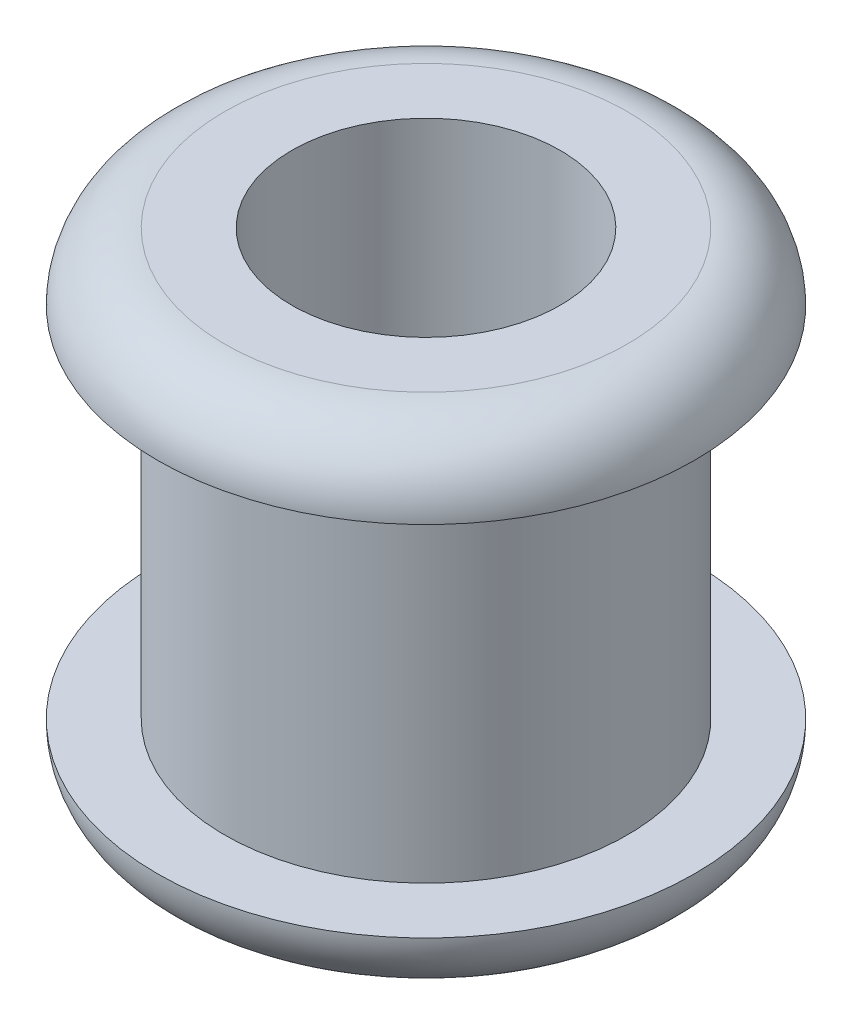
ISO-10303-21;
HEADER;
FILE_DESCRIPTION(('STEP AP214'),'2;1');
FILE_NAME('part.step','',(''),(''),'','','');
FILE_SCHEMA(('AUTOMOTIVE_DESIGN { 1 0 10303 214 1 1 1 1 }'));
ENDSEC;
DATA;
#1=APPLICATION_CONTEXT('core data for automotive mechanical design processes');
#2=APPLICATION_PROTOCOL_DEFINITION('international standard','automotive_design',2000,#1);
#3=PRODUCT_CONTEXT('',#1,'mechanical');
#4=PRODUCT('Part','Part','',(#3));
#5=PRODUCT_RELATED_PRODUCT_CATEGORY('part','',(#4));
#6=PRODUCT_DEFINITION_FORMATION('','',#4);
#7=PRODUCT_DEFINITION_CONTEXT('part definition',#1,'design');
#8=PRODUCT_DEFINITION('design','',#6,#7);
#9=PRODUCT_DEFINITION_SHAPE('','',#8);
#10=(LENGTH_UNIT() NAMED_UNIT(*) SI_UNIT(.MILLI.,.METRE.));
#11=(NAMED_UNIT(*) PLANE_ANGLE_UNIT() SI_UNIT($,.RADIAN.));
#12=(NAMED_UNIT(*) SI_UNIT($,.STERADIAN.) SOLID_ANGLE_UNIT());
#13=UNCERTAINTY_MEASURE_WITH_UNIT(LENGTH_MEASURE(1.E-05),#10,'distance_accuracy_value','');
#14=(GEOMETRIC_REPRESENTATION_CONTEXT(3) GLOBAL_UNCERTAINTY_ASSIGNED_CONTEXT((#13)) GLOBAL_UNIT_ASSIGNED_CONTEXT((#10,
#11,#12)) REPRESENTATION_CONTEXT('',''));
#15=CARTESIAN_POINT('',(0.,0.,0.));
#16=DIRECTION('',(0.,0.,1.));
#17=DIRECTION('',(1.,0.,0.));
#18=AXIS2_PLACEMENT_3D('',#15,#16,#17);
#19=CARTESIAN_POINT('',(4.7625,0.,0.));
#20=DIRECTION('',(0.,-1.,0.));
#21=DIRECTION('',(1.,0.,0.));
#22=AXIS2_PLACEMENT_3D('',#19,#20,#21);
#23=PLANE('',#22);
#24=CARTESIAN_POINT('',(0.,0.,0.));
#25=DIRECTION('',(0.,1.,0.));
#26=DIRECTION('',(-1.,0.,0.));
#27=AXIS2_PLACEMENT_3D('',#24,#25,#26);
#28=CIRCLE('',#27,4.7625);
#29=CARTESIAN_POINT('',(-4.7625,0.,0.));
#30=VERTEX_POINT('',#29);
#31=EDGE_CURVE('E10',#30,#30,#28,.T.);
#32=ORIENTED_EDGE('',*,*,#31,.F.);
#33=EDGE_LOOP('',(#32));
#34=FACE_BOUND('',#33,.T.);
#35=CARTESIAN_POINT('',(0.,0.,0.));
#36=DIRECTION('',(0.,1.,0.));
#37=DIRECTION('',(-1.,0.,0.));
#38=AXIS2_PLACEMENT_3D('',#35,#36,#37);
#39=CIRCLE('',#38,7.14375);
#40=CARTESIAN_POINT('',(-7.14375,0.,0.));
#41=VERTEX_POINT('',#40);
#42=EDGE_CURVE('E60',#41,#41,#39,.T.);
#43=ORIENTED_EDGE('',*,*,#42,.T.);
#44=EDGE_LOOP('',(#43));
#45=FACE_BOUND('',#44,.T.);
#46=ADVANCED_FACE('F32',(#34,#45),#23,.F.);
#47=CARTESIAN_POINT('',(0.,0.,0.));
#48=DIRECTION('',(0.,1.,0.));
#49=DIRECTION('',(-1.,0.,0.));
#50=AXIS2_PLACEMENT_3D('',#47,#48,#49);
#51=CYLINDRICAL_SURFACE('',#50,4.7625);
#52=CARTESIAN_POINT('',(0.,-17.4624999999999,0.));
#53=DIRECTION('',(0.,1.,0.));
#54=DIRECTION('',(-1.,0.,0.));
#55=AXIS2_PLACEMENT_3D('',#52,#53,#54);
#56=CIRCLE('',#55,4.7625);
#57=CARTESIAN_POINT('',(-4.7625,-17.4624999999999,0.));
#58=VERTEX_POINT('',#57);
#59=EDGE_CURVE('E38',#58,#58,#56,.T.);
#60=ORIENTED_EDGE('',*,*,#59,.F.);
#61=EDGE_LOOP('',(#60));
#62=FACE_BOUND('',#61,.T.);
#63=ORIENTED_EDGE('',*,*,#31,.T.);
#64=EDGE_LOOP('',(#63));
#65=FACE_BOUND('',#64,.T.);
#66=ADVANCED_FACE('F97',(#62,#65),#51,.F.);
#67=CARTESIAN_POINT('',(4.7625,-17.4624999999999,0.));
#68=DIRECTION('',(0.,1.,0.));
#69=DIRECTION('',(-1.,0.,0.));
#70=AXIS2_PLACEMENT_3D('',#67,#68,#69);
#71=PLANE('',#70);
#72=CARTESIAN_POINT('',(0.,-17.4624999999999,0.));
#73=DIRECTION('',(0.,1.,0.));
#74=DIRECTION('',(-1.,0.,0.));
#75=AXIS2_PLACEMENT_3D('',#72,#73,#74);
#76=CIRCLE('',#75,7.14375);
#77=CARTESIAN_POINT('',(-7.14375,-17.4624999999999,0.));
#78=VERTEX_POINT('',#77);
#79=EDGE_CURVE('E42',#78,#78,#76,.T.);
#80=ORIENTED_EDGE('',*,*,#79,.F.);
#81=EDGE_LOOP('',(#80));
#82=FACE_BOUND('',#81,.T.);
#83=ORIENTED_EDGE('',*,*,#59,.T.);
#84=EDGE_LOOP('',(#83));
#85=FACE_BOUND('',#84,.T.);
#86=ADVANCED_FACE('F92',(#82,#85),#71,.F.);
#87=CARTESIAN_POINT('',(0.,-15.0812499999999,0.));
#88=DIRECTION('',(0.,1.,0.));
#89=DIRECTION('',(-1.,0.,0.));
#90=AXIS2_PLACEMENT_3D('',#87,#88,#89);
#91=TOROIDAL_SURFACE('',#90,7.14375,2.38125);
#92=CARTESIAN_POINT('',(0.,-15.0812499999999,0.));
#93=DIRECTION('',(0.,1.,0.));
#94=DIRECTION('',(-1.,0.,0.));
#95=AXIS2_PLACEMENT_3D('',#92,#93,#94);
#96=CIRCLE('',#95,9.525);
#97=CARTESIAN_POINT('',(-9.525,-15.0812499999999,0.));
#98=VERTEX_POINT('',#97);
#99=EDGE_CURVE('E46',#98,#98,#96,.T.);
#100=ORIENTED_EDGE('',*,*,#99,.F.);
#101=EDGE_LOOP('',(#100));
#102=FACE_BOUND('',#101,.T.);
#103=ORIENTED_EDGE('',*,*,#79,.T.);
#104=EDGE_LOOP('',(#103));
#105=FACE_BOUND('',#104,.T.);
#106=ADVANCED_FACE('F86',(#102,#105),#91,.T.);
#107=CARTESIAN_POINT('',(9.52500000000001,-15.0812499999999,0.));
#108=DIRECTION('',(0.,-1.,0.));
#109=DIRECTION('',(1.,0.,0.));
#110=AXIS2_PLACEMENT_3D('',#107,#108,#109);
#111=PLANE('',#110);
#112=CARTESIAN_POINT('',(0.,-15.0812499999999,0.));
#113=DIRECTION('',(0.,1.,0.));
#114=DIRECTION('',(-1.,0.,0.));
#115=AXIS2_PLACEMENT_3D('',#112,#113,#114);
#116=CIRCLE('',#115,7.14375);
#117=CARTESIAN_POINT('',(-7.14375,-15.0812499999999,0.));
#118=VERTEX_POINT('',#117);
#119=EDGE_CURVE('E51',#118,#118,#116,.T.);
#120=ORIENTED_EDGE('',*,*,#119,.F.);
#121=EDGE_LOOP('',(#120));
#122=FACE_BOUND('',#121,.T.);
#123=ORIENTED_EDGE('',*,*,#99,.T.);
#124=EDGE_LOOP('',(#123));
#125=FACE_BOUND('',#124,.T.);
#126=ADVANCED_FACE('F80',(#122,#125),#111,.F.);
#127=CARTESIAN_POINT('',(0.,0.,0.));
#128=DIRECTION('',(0.,1.,0.));
#129=DIRECTION('',(-1.,0.,0.));
#130=AXIS2_PLACEMENT_3D('',#127,#128,#129);
#131=CYLINDRICAL_SURFACE('',#130,7.14375);
#132=CARTESIAN_POINT('',(0.,-2.38125,0.));
#133=DIRECTION('',(0.,1.,0.));
#134=DIRECTION('',(-1.,0.,0.));
#135=AXIS2_PLACEMENT_3D('',#132,#133,#134);
#136=CIRCLE('',#135,7.14375);
#137=CARTESIAN_POINT('',(-7.14375,-2.38125,0.));
#138=VERTEX_POINT('',#137);
#139=EDGE_CURVE('E54',#138,#138,#136,.T.);
#140=ORIENTED_EDGE('',*,*,#139,.F.);
#141=EDGE_LOOP('',(#140));
#142=FACE_BOUND('',#141,.T.);
#143=ORIENTED_EDGE('',*,*,#119,.T.);
#144=EDGE_LOOP('',(#143));
#145=FACE_BOUND('',#144,.T.);
#146=ADVANCED_FACE('F74',(#142,#145),#131,.T.);
#147=CARTESIAN_POINT('',(7.14375,-2.38125,0.));
#148=DIRECTION('',(0.,1.,0.));
#149=DIRECTION('',(-1.,0.,0.));
#150=AXIS2_PLACEMENT_3D('',#147,#148,#149);
#151=PLANE('',#150);
#152=CARTESIAN_POINT('',(0.,-2.38125,0.));
#153=DIRECTION('',(0.,1.,0.));
#154=DIRECTION('',(-1.,0.,0.));
#155=AXIS2_PLACEMENT_3D('',#152,#153,#154);
#156=CIRCLE('',#155,9.525);
#157=CARTESIAN_POINT('',(-9.525,-2.38125,0.));
#158=VERTEX_POINT('',#157);
#159=EDGE_CURVE('E57',#158,#158,#156,.T.);
#160=ORIENTED_EDGE('',*,*,#159,.F.);
#161=EDGE_LOOP('',(#160));
#162=FACE_BOUND('',#161,.T.);
#163=ORIENTED_EDGE('',*,*,#139,.T.);
#164=EDGE_LOOP('',(#163));
#165=FACE_BOUND('',#164,.T.);
#166=ADVANCED_FACE('F68',(#162,#165),#151,.F.);
#167=CARTESIAN_POINT('',(0.,-2.38125,0.));
#168=DIRECTION('',(0.,1.,0.));
#169=DIRECTION('',(-1.,0.,0.));
#170=AXIS2_PLACEMENT_3D('',#167,#168,#169);
#171=TOROIDAL_SURFACE('',#170,7.14375,2.38125);
#172=ORIENTED_EDGE('',*,*,#42,.F.);
#173=EDGE_LOOP('',(#172));
#174=FACE_BOUND('',#173,.T.);
#175=ORIENTED_EDGE('',*,*,#159,.T.);
#176=EDGE_LOOP('',(#175));
#177=FACE_BOUND('',#176,.T.);
#178=ADVANCED_FACE('F65',(#174,#177),#171,.T.);
#179=CLOSED_SHELL('',(#46,#66,#86,#106,#126,#146,#166,#178));
#180=MANIFOLD_SOLID_BREP('B2',#179);
#181=ADVANCED_BREP_SHAPE_REPRESENTATION('',(#18,#180),#14);
#182=SHAPE_DEFINITION_REPRESENTATION(#9,#181);
ENDSEC;
END-ISO-10303-21;
